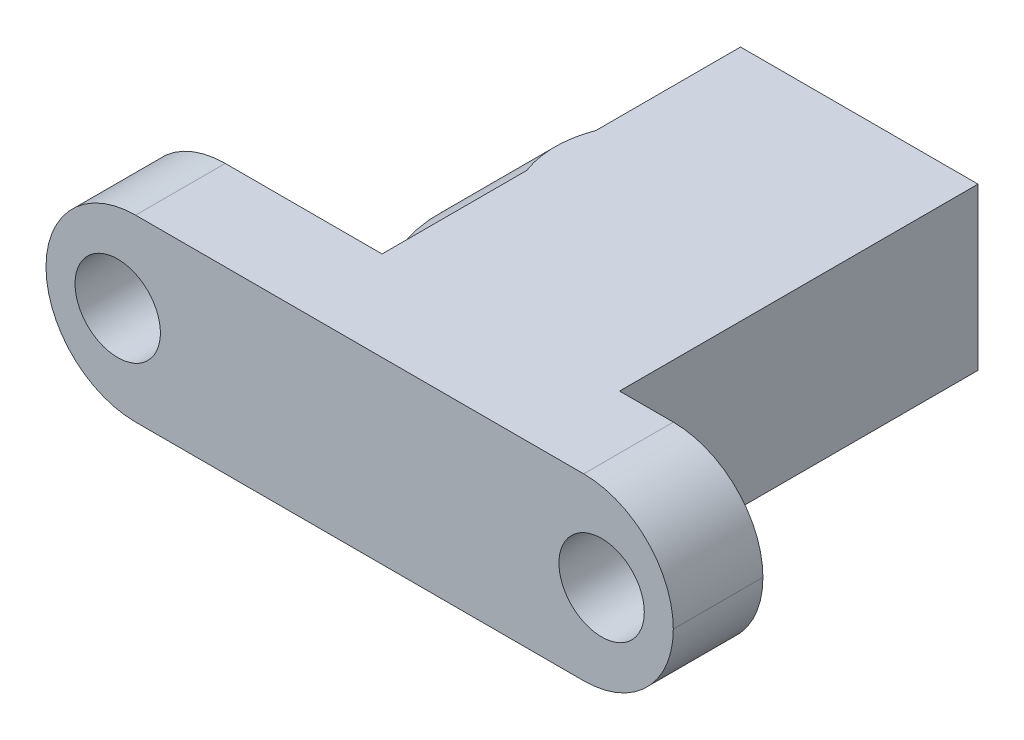
ISO-10303-21;
HEADER;
FILE_DESCRIPTION(('STEP AP214'),'2;1');
FILE_NAME('part.step','',(''),(''),'','','');
FILE_SCHEMA(('AUTOMOTIVE_DESIGN { 1 0 10303 214 1 1 1 1 }'));
ENDSEC;
DATA;
#1=APPLICATION_CONTEXT('core data for automotive mechanical design processes');
#2=APPLICATION_PROTOCOL_DEFINITION('international standard','automotive_design',2000,#1);
#3=PRODUCT_CONTEXT('',#1,'mechanical');
#4=PRODUCT('Part','Part','',(#3));
#5=PRODUCT_RELATED_PRODUCT_CATEGORY('part','',(#4));
#6=PRODUCT_DEFINITION_FORMATION('','',#4);
#7=PRODUCT_DEFINITION_CONTEXT('part definition',#1,'design');
#8=PRODUCT_DEFINITION('design','',#6,#7);
#9=PRODUCT_DEFINITION_SHAPE('','',#8);
#10=(LENGTH_UNIT() NAMED_UNIT(*) SI_UNIT(.MILLI.,.METRE.));
#11=(NAMED_UNIT(*) PLANE_ANGLE_UNIT() SI_UNIT($,.RADIAN.));
#12=(NAMED_UNIT(*) SI_UNIT($,.STERADIAN.) SOLID_ANGLE_UNIT());
#13=UNCERTAINTY_MEASURE_WITH_UNIT(LENGTH_MEASURE(1.E-05),#10,'distance_accuracy_value','');
#14=(GEOMETRIC_REPRESENTATION_CONTEXT(3) GLOBAL_UNCERTAINTY_ASSIGNED_CONTEXT((#13)) GLOBAL_UNIT_ASSIGNED_CONTEXT((#10,
#11,#12)) REPRESENTATION_CONTEXT('',''));
#15=CARTESIAN_POINT('',(0.,0.,0.));
#16=DIRECTION('',(0.,0.,1.));
#17=DIRECTION('',(1.,0.,0.));
#18=AXIS2_PLACEMENT_3D('',#15,#16,#17);
#19=CARTESIAN_POINT('',(9.50000000000001,-4.,-20.));
#20=DIRECTION('',(0.,1.,0.));
#21=DIRECTION('',(0.,0.,1.));
#22=AXIS2_PLACEMENT_3D('',#19,#20,#21);
#23=PLANE('',#22);
#24=DIRECTION('',(-1.,0.,0.));
#25=VECTOR('',#24,1.);
#26=CARTESIAN_POINT('',(9.50000000000001,-4.,-20.));
#27=LINE('',#26,#25);
#28=CARTESIAN_POINT('',(5.98528137423857,-4.,-20.));
#29=VERTEX_POINT('',#28);
#30=CARTESIAN_POINT('',(-2.49999999999999,-4.,-20.));
#31=VERTEX_POINT('',#30);
#32=EDGE_CURVE('E208',#29,#31,#27,.T.);
#33=ORIENTED_EDGE('',*,*,#32,.F.);
#34=DIRECTION('',(0.,0.,-1.));
#35=VECTOR('',#34,1.);
#36=CARTESIAN_POINT('',(5.98528137423857,-4.,1.55322710705489));
#37=LINE('',#36,#35);
#38=CARTESIAN_POINT('',(5.98528137423857,-4.,-14.5));
#39=VERTEX_POINT('',#38);
#40=EDGE_CURVE('E191',#39,#29,#37,.T.);
#41=ORIENTED_EDGE('',*,*,#40,.F.);
#42=CARTESIAN_POINT('',(-2.49999999999999,-4.,-10.));
#43=DIRECTION('',(0.,1.,0.));
#44=DIRECTION('',(1.,0.,0.));
#45=AXIS2_PLACEMENT_3D('',#42,#43,#44);
#46=ELLIPSE('',#45,10.6066017177982,7.5);
#47=CARTESIAN_POINT('',(-2.49999999999999,-4.,-17.5));
#48=VERTEX_POINT('',#47);
#49=EDGE_CURVE('E355',#48,#39,#46,.F.);
#50=ORIENTED_EDGE('',*,*,#49,.F.);
#51=DIRECTION('',(0.,0.,1.));
#52=VECTOR('',#51,1.);
#53=CARTESIAN_POINT('',(-2.49999999999999,-4.,-20.));
#54=LINE('',#53,#52);
#55=EDGE_CURVE('E216',#31,#48,#54,.T.);
#56=ORIENTED_EDGE('',*,*,#55,.F.);
#57=EDGE_LOOP('',(#33,#41,#50,#56));
#58=FACE_BOUND('',#57,.T.);
#59=ADVANCED_FACE('F36',(#58),#23,.F.);
#60=CARTESIAN_POINT('',(5.98528137423857,-4.,-5.49999999999997));
#61=VERTEX_POINT('',#60);
#62=CARTESIAN_POINT('',(-2.49999999999999,-4.,-2.5));
#63=VERTEX_POINT('',#62);
#64=EDGE_CURVE('E350',#61,#63,#46,.F.);
#65=ORIENTED_EDGE('',*,*,#64,.F.);
#66=CARTESIAN_POINT('',(5.98528137423857,-4.,0.));
#67=VERTEX_POINT('',#66);
#68=EDGE_CURVE('E202',#67,#61,#37,.T.);
#69=ORIENTED_EDGE('',*,*,#68,.F.);
#70=DIRECTION('',(-1.,0.,0.));
#71=VECTOR('',#70,1.);
#72=CARTESIAN_POINT('',(9.50000000000001,-4.,0.));
#73=LINE('',#72,#71);
#74=CARTESIAN_POINT('',(-2.49999999999999,-4.,0.));
#75=VERTEX_POINT('',#74);
#76=EDGE_CURVE('E229',#67,#75,#73,.T.);
#77=ORIENTED_EDGE('',*,*,#76,.T.);
#78=EDGE_CURVE('E221',#63,#75,#54,.T.);
#79=ORIENTED_EDGE('',*,*,#78,.F.);
#80=EDGE_LOOP('',(#65,#69,#77,#79));
#81=FACE_BOUND('',#80,.T.);
#82=ADVANCED_FACE('F451',(#81),#23,.F.);
#83=CARTESIAN_POINT('',(0.,0.,0.));
#84=DIRECTION('',(0.,0.,-1.));
#85=DIRECTION('',(-1.,0.,0.));
#86=AXIS2_PLACEMENT_3D('',#83,#84,#85);
#87=PLANE('',#86);
#88=DIRECTION('',(0.,-1.,0.));
#89=VECTOR('',#88,1.);
#90=CARTESIAN_POINT('',(5.98528137423857,-4.,0.));
#91=LINE('',#90,#89);
#92=CARTESIAN_POINT('',(5.98528137423857,-5.,0.));
#93=VERTEX_POINT('',#92);
#94=EDGE_CURVE('E394',#67,#93,#91,.T.);
#95=ORIENTED_EDGE('',*,*,#94,.T.);
#96=DIRECTION('',(1.,0.,0.));
#97=VECTOR('',#96,1.);
#98=CARTESIAN_POINT('',(-17.5,-5.,0.));
#99=LINE('',#98,#97);
#100=CARTESIAN_POINT('',(-12.5,-5.,0.));
#101=VERTEX_POINT('',#100);
#102=EDGE_CURVE('E261',#101,#93,#99,.T.);
#103=ORIENTED_EDGE('',*,*,#102,.F.);
#104=CARTESIAN_POINT('',(-12.5,0.,0.));
#105=DIRECTION('',(0.,0.,-1.));
#106=DIRECTION('',(-1.,0.,0.));
#107=AXIS2_PLACEMENT_3D('',#104,#105,#106);
#108=CIRCLE('',#107,5.);
#109=CARTESIAN_POINT('',(-17.5,0.,0.));
#110=VERTEX_POINT('',#109);
#111=EDGE_CURVE('E281',#101,#110,#108,.T.);
#112=ORIENTED_EDGE('',*,*,#111,.T.);
#113=CARTESIAN_POINT('',(-12.5,0.,0.));
#114=DIRECTION('',(0.,0.,-1.));
#115=DIRECTION('',(-1.,0.,0.));
#116=AXIS2_PLACEMENT_3D('',#113,#114,#115);
#117=CIRCLE('',#116,5.);
#118=CARTESIAN_POINT('',(-12.5,5.,0.));
#119=VERTEX_POINT('',#118);
#120=EDGE_CURVE('E278',#110,#119,#117,.T.);
#121=ORIENTED_EDGE('',*,*,#120,.T.);
#122=DIRECTION('',(-1.,0.,0.));
#123=VECTOR('',#122,1.);
#124=CARTESIAN_POINT('',(-17.5,5.,0.));
#125=LINE('',#124,#123);
#126=CARTESIAN_POINT('',(-3.74999999999999,5.,0.));
#127=VERTEX_POINT('',#126);
#128=EDGE_CURVE('E255',#127,#119,#125,.T.);
#129=ORIENTED_EDGE('',*,*,#128,.F.);
#130=DIRECTION('',(0.,-1.,0.));
#131=VECTOR('',#130,1.);
#132=CARTESIAN_POINT('',(-3.74999999999999,4.48528137423858,0.));
#133=LINE('',#132,#131);
#134=CARTESIAN_POINT('',(-3.74999999999999,4.48528137423858,0.));
#135=VERTEX_POINT('',#134);
#136=EDGE_CURVE('E342',#127,#135,#133,.T.);
#137=ORIENTED_EDGE('',*,*,#136,.T.);
#138=DIRECTION('',(1.,0.,0.));
#139=VECTOR('',#138,1.);
#140=CARTESIAN_POINT('',(-2.49999999999999,4.48528137423858,0.));
#141=LINE('',#140,#139);
#142=CARTESIAN_POINT('',(-2.49999999999999,4.48528137423858,0.));
#143=VERTEX_POINT('',#142);
#144=EDGE_CURVE('E328',#135,#143,#141,.T.);
#145=ORIENTED_EDGE('',*,*,#144,.T.);
#146=DIRECTION('',(0.,1.,0.));
#147=VECTOR('',#146,1.);
#148=CARTESIAN_POINT('',(-2.49999999999999,-4.,0.));
#149=LINE('',#148,#147);
#150=EDGE_CURVE('E234',#75,#143,#149,.T.);
#151=ORIENTED_EDGE('',*,*,#150,.F.);
#152=ORIENTED_EDGE('',*,*,#76,.F.);
#153=EDGE_LOOP('',(#95,#103,#112,#121,#129,#137,#145,#151,#152));
#154=FACE_BOUND('',#153,.T.);
#155=CARTESIAN_POINT('',(-13.5,0.,0.));
#156=DIRECTION('',(0.,0.,1.));
#157=DIRECTION('',(-1.,0.,0.));
#158=AXIS2_PLACEMENT_3D('',#155,#156,#157);
#159=CIRCLE('',#158,2.38125);
#160=CARTESIAN_POINT('',(-15.88125,0.,0.));
#161=VERTEX_POINT('',#160);
#162=EDGE_CURVE('E245',#161,#161,#159,.T.);
#163=ORIENTED_EDGE('',*,*,#162,.T.);
#164=EDGE_LOOP('',(#163));
#165=FACE_BOUND('',#164,.T.);
#166=ADVANCED_FACE('F414',(#154,#165),#87,.T.);
#167=CARTESIAN_POINT('',(-2.49999999999999,-4.,-20.));
#168=DIRECTION('',(1.,0.,0.));
#169=DIRECTION('',(0.,0.,-1.));
#170=AXIS2_PLACEMENT_3D('',#167,#168,#169);
#171=PLANE('',#170);
#172=ORIENTED_EDGE('',*,*,#150,.T.);
#173=DIRECTION('',(0.,0.,-1.));
#174=VECTOR('',#173,1.);
#175=CARTESIAN_POINT('',(-2.49999999999999,4.48528137423858,1.35182663966417));
#176=LINE('',#175,#174);
#177=CARTESIAN_POINT('',(-2.49999999999999,4.48528137423858,-5.50000000000003));
#178=VERTEX_POINT('',#177);
#179=EDGE_CURVE('E335',#143,#178,#176,.T.);
#180=ORIENTED_EDGE('',*,*,#179,.T.);
#181=CARTESIAN_POINT('',(-2.49999999999999,-4.,-10.));
#182=DIRECTION('',(1.,0.,0.));
#183=DIRECTION('',(0.,1.,0.));
#184=AXIS2_PLACEMENT_3D('',#181,#182,#183);
#185=ELLIPSE('',#184,10.6066017177982,7.5);
#186=EDGE_CURVE('E263',#63,#178,#185,.F.);
#187=ORIENTED_EDGE('',*,*,#186,.F.);
#188=ORIENTED_EDGE('',*,*,#78,.T.);
#189=EDGE_LOOP('',(#172,#180,#187,#188));
#190=FACE_BOUND('',#189,.T.);
#191=ADVANCED_FACE('F460',(#190),#171,.F.);
#192=CARTESIAN_POINT('',(9.50000000000001,-4.,0.));
#193=VERTEX_POINT('',#192);
#194=CARTESIAN_POINT('',(7.17377388413928,-4.,0.));
#195=VERTEX_POINT('',#194);
#196=EDGE_CURVE('E231',#193,#195,#73,.T.);
#197=ORIENTED_EDGE('',*,*,#196,.T.);
#198=DIRECTION('',(0.,0.,-1.));
#199=VECTOR('',#198,1.);
#200=CARTESIAN_POINT('',(7.17377388413928,-4.,1.55322710705489));
#201=LINE('',#200,#199);
#202=CARTESIAN_POINT('',(7.17377388413928,-4.,-20.));
#203=VERTEX_POINT('',#202);
#204=EDGE_CURVE('E376',#195,#203,#201,.T.);
#205=ORIENTED_EDGE('',*,*,#204,.T.);
#206=CARTESIAN_POINT('',(9.50000000000001,-4.,-20.));
#207=VERTEX_POINT('',#206);
#208=EDGE_CURVE('E217',#207,#203,#27,.T.);
#209=ORIENTED_EDGE('',*,*,#208,.F.);
#210=DIRECTION('',(0.,0.,1.));
#211=VECTOR('',#210,1.);
#212=CARTESIAN_POINT('',(9.50000000000001,-4.,-20.));
#213=LINE('',#212,#211);
#214=EDGE_CURVE('E239',#207,#193,#213,.T.);
#215=ORIENTED_EDGE('',*,*,#214,.T.);
#216=EDGE_LOOP('',(#197,#205,#209,#215));
#217=FACE_BOUND('',#216,.T.);
#218=ADVANCED_FACE('F375',(#217),#23,.F.);
#219=CARTESIAN_POINT('',(-2.49999999999999,4.48528137423858,-14.5));
#220=VERTEX_POINT('',#219);
#221=EDGE_CURVE('E271',#220,#48,#185,.F.);
#222=ORIENTED_EDGE('',*,*,#221,.F.);
#223=CARTESIAN_POINT('',(-2.49999999999999,4.48528137423858,-20.));
#224=VERTEX_POINT('',#223);
#225=EDGE_CURVE('E339',#220,#224,#176,.T.);
#226=ORIENTED_EDGE('',*,*,#225,.T.);
#227=DIRECTION('',(0.,1.,0.));
#228=VECTOR('',#227,1.);
#229=CARTESIAN_POINT('',(-2.49999999999999,4.,-20.));
#230=LINE('',#229,#228);
#231=EDGE_CURVE('E237',#31,#224,#230,.T.);
#232=ORIENTED_EDGE('',*,*,#231,.F.);
#233=ORIENTED_EDGE('',*,*,#55,.T.);
#234=EDGE_LOOP('',(#222,#226,#232,#233));
#235=FACE_BOUND('',#234,.T.);
#236=ADVANCED_FACE('F404',(#235),#171,.F.);
#237=CARTESIAN_POINT('',(0.,0.,5.));
#238=DIRECTION('',(0.,0.,-1.));
#239=DIRECTION('',(-1.,0.,0.));
#240=AXIS2_PLACEMENT_3D('',#237,#238,#239);
#241=PLANE('',#240);
#242=CARTESIAN_POINT('',(12.5,0.,5.));
#243=DIRECTION('',(0.,0.,-1.));
#244=DIRECTION('',(-1.,0.,0.));
#245=AXIS2_PLACEMENT_3D('',#242,#243,#244);
#246=CIRCLE('',#245,5.);
#247=CARTESIAN_POINT('',(12.5,-5.,5.));
#248=VERTEX_POINT('',#247);
#249=CARTESIAN_POINT('',(17.5,0.,5.));
#250=VERTEX_POINT('',#249);
#251=EDGE_CURVE('E292',#248,#250,#246,.F.);
#252=ORIENTED_EDGE('',*,*,#251,.T.);
#253=CARTESIAN_POINT('',(12.5,0.,5.));
#254=DIRECTION('',(0.,0.,-1.));
#255=DIRECTION('',(-1.,0.,0.));
#256=AXIS2_PLACEMENT_3D('',#253,#254,#255);
#257=CIRCLE('',#256,5.);
#258=CARTESIAN_POINT('',(12.5,5.,5.));
#259=VERTEX_POINT('',#258);
#260=EDGE_CURVE('E294',#250,#259,#257,.F.);
#261=ORIENTED_EDGE('',*,*,#260,.T.);
#262=DIRECTION('',(-1.,0.,0.));
#263=VECTOR('',#262,1.);
#264=CARTESIAN_POINT('',(-17.5,5.,5.));
#265=LINE('',#264,#263);
#266=CARTESIAN_POINT('',(-12.5,5.,5.));
#267=VERTEX_POINT('',#266);
#268=EDGE_CURVE('E258',#259,#267,#265,.T.);
#269=ORIENTED_EDGE('',*,*,#268,.T.);
#270=CARTESIAN_POINT('',(-12.5,0.,5.));
#271=DIRECTION('',(0.,0.,-1.));
#272=DIRECTION('',(-1.,0.,0.));
#273=AXIS2_PLACEMENT_3D('',#270,#271,#272);
#274=CIRCLE('',#273,5.);
#275=CARTESIAN_POINT('',(-17.5,0.,5.));
#276=VERTEX_POINT('',#275);
#277=EDGE_CURVE('E288',#267,#276,#274,.F.);
#278=ORIENTED_EDGE('',*,*,#277,.T.);
#279=CARTESIAN_POINT('',(-12.5,0.,5.));
#280=DIRECTION('',(0.,0.,-1.));
#281=DIRECTION('',(-1.,0.,0.));
#282=AXIS2_PLACEMENT_3D('',#279,#280,#281);
#283=CIRCLE('',#282,5.);
#284=CARTESIAN_POINT('',(-12.5,-5.,5.));
#285=VERTEX_POINT('',#284);
#286=EDGE_CURVE('E290',#276,#285,#283,.F.);
#287=ORIENTED_EDGE('',*,*,#286,.T.);
#288=DIRECTION('',(1.,0.,0.));
#289=VECTOR('',#288,1.);
#290=CARTESIAN_POINT('',(-17.5,-5.,5.));
#291=LINE('',#290,#289);
#292=EDGE_CURVE('E260',#285,#248,#291,.T.);
#293=ORIENTED_EDGE('',*,*,#292,.T.);
#294=EDGE_LOOP('',(#252,#261,#269,#278,#287,#293));
#295=FACE_BOUND('',#294,.T.);
#296=CARTESIAN_POINT('',(13.5,0.,5.));
#297=DIRECTION('',(0.,0.,1.));
#298=DIRECTION('',(1.,0.,0.));
#299=AXIS2_PLACEMENT_3D('',#296,#297,#298);
#300=CIRCLE('',#299,2.38125000000001);
#301=CARTESIAN_POINT('',(15.88125,0.,5.));
#302=VERTEX_POINT('',#301);
#303=EDGE_CURVE('E252',#302,#302,#300,.T.);
#304=ORIENTED_EDGE('',*,*,#303,.F.);
#305=EDGE_LOOP('',(#304));
#306=FACE_BOUND('',#305,.T.);
#307=CARTESIAN_POINT('',(-13.5,0.,5.));
#308=DIRECTION('',(0.,0.,1.));
#309=DIRECTION('',(-1.,0.,0.));
#310=AXIS2_PLACEMENT_3D('',#307,#308,#309);
#311=CIRCLE('',#310,2.38125);
#312=CARTESIAN_POINT('',(-15.88125,0.,5.));
#313=VERTEX_POINT('',#312);
#314=EDGE_CURVE('E246',#313,#313,#311,.T.);
#315=ORIENTED_EDGE('',*,*,#314,.F.);
#316=EDGE_LOOP('',(#315));
#317=FACE_BOUND('',#316,.T.);
#318=ADVANCED_FACE('F437',(#295,#306,#317),#241,.F.);
#319=DIRECTION('',(0.,1.,0.));
#320=VECTOR('',#319,1.);
#321=CARTESIAN_POINT('',(7.17377388413928,-4.,0.));
#322=LINE('',#321,#320);
#323=CARTESIAN_POINT('',(7.17377388413928,-5.,0.));
#324=VERTEX_POINT('',#323);
#325=EDGE_CURVE('E388',#324,#195,#322,.T.);
#326=ORIENTED_EDGE('',*,*,#325,.T.);
#327=ORIENTED_EDGE('',*,*,#196,.F.);
#328=DIRECTION('',(0.,-1.,0.));
#329=VECTOR('',#328,1.);
#330=CARTESIAN_POINT('',(9.50000000000001,-4.,0.));
#331=LINE('',#330,#329);
#332=CARTESIAN_POINT('',(9.50000000000002,5.,0.));
#333=VERTEX_POINT('',#332);
#334=EDGE_CURVE('E226',#333,#193,#331,.T.);
#335=ORIENTED_EDGE('',*,*,#334,.F.);
#336=CARTESIAN_POINT('',(12.5,5.,0.));
#337=VERTEX_POINT('',#336);
#338=EDGE_CURVE('E264',#337,#333,#125,.T.);
#339=ORIENTED_EDGE('',*,*,#338,.F.);
#340=CARTESIAN_POINT('',(12.5,0.,0.));
#341=DIRECTION('',(0.,0.,-1.));
#342=DIRECTION('',(-1.,0.,0.));
#343=AXIS2_PLACEMENT_3D('',#340,#341,#342);
#344=CIRCLE('',#343,5.);
#345=CARTESIAN_POINT('',(17.5,0.,0.));
#346=VERTEX_POINT('',#345);
#347=EDGE_CURVE('E286',#337,#346,#344,.T.);
#348=ORIENTED_EDGE('',*,*,#347,.T.);
#349=CARTESIAN_POINT('',(12.5,0.,0.));
#350=DIRECTION('',(0.,0.,-1.));
#351=DIRECTION('',(-1.,0.,0.));
#352=AXIS2_PLACEMENT_3D('',#349,#350,#351);
#353=CIRCLE('',#352,5.);
#354=CARTESIAN_POINT('',(12.5,-5.,0.));
#355=VERTEX_POINT('',#354);
#356=EDGE_CURVE('E283',#346,#355,#353,.T.);
#357=ORIENTED_EDGE('',*,*,#356,.T.);
#358=EDGE_CURVE('E266',#324,#355,#99,.T.);
#359=ORIENTED_EDGE('',*,*,#358,.F.);
#360=EDGE_LOOP('',(#326,#327,#335,#339,#348,#357,#359));
#361=FACE_BOUND('',#360,.T.);
#362=CARTESIAN_POINT('',(13.5,0.,0.));
#363=DIRECTION('',(0.,0.,1.));
#364=DIRECTION('',(1.,0.,0.));
#365=AXIS2_PLACEMENT_3D('',#362,#363,#364);
#366=CIRCLE('',#365,2.38125000000001);
#367=CARTESIAN_POINT('',(15.88125,0.,0.));
#368=VERTEX_POINT('',#367);
#369=EDGE_CURVE('E249',#368,#368,#366,.T.);
#370=ORIENTED_EDGE('',*,*,#369,.T.);
#371=EDGE_LOOP('',(#370));
#372=FACE_BOUND('',#371,.T.);
#373=ADVANCED_FACE('F432',(#361,#372),#87,.T.);
#374=CARTESIAN_POINT('',(-17.5,5.,5.));
#375=DIRECTION('',(0.,-1.,0.));
#376=DIRECTION('',(0.,0.,-1.));
#377=AXIS2_PLACEMENT_3D('',#374,#375,#376);
#378=PLANE('',#377);
#379=DIRECTION('',(0.,0.,-1.));
#380=VECTOR('',#379,1.);
#381=CARTESIAN_POINT('',(-12.5,5.,5.));
#382=LINE('',#381,#380);
#383=EDGE_CURVE('E272',#119,#267,#382,.F.);
#384=ORIENTED_EDGE('',*,*,#383,.T.);
#385=ORIENTED_EDGE('',*,*,#268,.F.);
#386=DIRECTION('',(0.,0.,-1.));
#387=VECTOR('',#386,1.);
#388=CARTESIAN_POINT('',(12.5,5.,5.));
#389=LINE('',#388,#387);
#390=EDGE_CURVE('E275',#259,#337,#389,.T.);
#391=ORIENTED_EDGE('',*,*,#390,.T.);
#392=ORIENTED_EDGE('',*,*,#338,.T.);
#393=DIRECTION('',(0.,0.,1.));
#394=VECTOR('',#393,1.);
#395=CARTESIAN_POINT('',(9.50000000000001,5.,-20.));
#396=LINE('',#395,#394);
#397=CARTESIAN_POINT('',(9.50000000000001,5.,-20.));
#398=VERTEX_POINT('',#397);
#399=EDGE_CURVE('E242',#398,#333,#396,.T.);
#400=ORIENTED_EDGE('',*,*,#399,.F.);
#401=DIRECTION('',(1.,0.,0.));
#402=VECTOR('',#401,1.);
#403=CARTESIAN_POINT('',(9.50000000000001,5.,-20.));
#404=LINE('',#403,#402);
#405=CARTESIAN_POINT('',(-3.74999999999999,5.,-20.));
#406=VERTEX_POINT('',#405);
#407=EDGE_CURVE('E222',#406,#398,#404,.T.);
#408=ORIENTED_EDGE('',*,*,#407,.F.);
#409=DIRECTION('',(0.,0.,-1.));
#410=VECTOR('',#409,1.);
#411=CARTESIAN_POINT('',(-3.74999999999999,5.,1.35182663966417));
#412=LINE('',#411,#410);
#413=CARTESIAN_POINT('',(-3.74999999999999,5.,-11.9284060775677));
#414=VERTEX_POINT('',#413);
#415=EDGE_CURVE('E330',#414,#406,#412,.T.);
#416=ORIENTED_EDGE('',*,*,#415,.F.);
#417=CARTESIAN_POINT('',(6.50000000000004,5.,-10.));
#418=DIRECTION('',(0.,-1.,0.));
#419=DIRECTION('',(1.,0.,0.));
#420=AXIS2_PLACEMENT_3D('',#417,#418,#419);
#421=ELLIPSE('',#420,10.6066017177982,7.5);
#422=CARTESIAN_POINT('',(-3.74999999999999,5.,-8.07159392243235));
#423=VERTEX_POINT('',#422);
#424=EDGE_CURVE('E315',#423,#414,#421,.T.);
#425=ORIENTED_EDGE('',*,*,#424,.F.);
#426=EDGE_CURVE('E323',#127,#423,#412,.T.);
#427=ORIENTED_EDGE('',*,*,#426,.F.);
#428=ORIENTED_EDGE('',*,*,#128,.T.);
#429=EDGE_LOOP('',(#384,#385,#391,#392,#400,#408,#416,#425,#427,#428));
#430=FACE_BOUND('',#429,.T.);
#431=ADVANCED_FACE('F367',(#430),#378,.F.);
#432=CARTESIAN_POINT('',(-17.5,-5.,5.));
#433=DIRECTION('',(0.,1.,0.));
#434=DIRECTION('',(0.,0.,1.));
#435=AXIS2_PLACEMENT_3D('',#432,#433,#434);
#436=PLANE('',#435);
#437=ORIENTED_EDGE('',*,*,#102,.T.);
#438=DIRECTION('',(0.,0.,-1.));
#439=VECTOR('',#438,1.);
#440=CARTESIAN_POINT('',(5.98528137423857,-5.,1.55322710705489));
#441=LINE('',#440,#439);
#442=CARTESIAN_POINT('',(5.98528137423857,-5.,-6.64370462775373));
#443=VERTEX_POINT('',#442);
#444=EDGE_CURVE('E386',#93,#443,#441,.T.);
#445=ORIENTED_EDGE('',*,*,#444,.T.);
#446=CARTESIAN_POINT('',(-3.49999999999999,-5.,-10.));
#447=DIRECTION('',(0.,-1.,0.));
#448=DIRECTION('',(1.,0.,0.));
#449=AXIS2_PLACEMENT_3D('',#446,#447,#448);
#450=ELLIPSE('',#449,10.6066017177982,7.5);
#451=CARTESIAN_POINT('',(6.98528137423856,-5.,-8.86887787948285));
#452=VERTEX_POINT('',#451);
#453=EDGE_CURVE('E51',#452,#443,#450,.T.);
#454=ORIENTED_EDGE('',*,*,#453,.F.);
#455=DIRECTION('',(0.,0.,1.));
#456=VECTOR('',#455,1.);
#457=CARTESIAN_POINT('',(6.98528137423856,-5.,-10.));
#458=LINE('',#457,#456);
#459=CARTESIAN_POINT('',(6.98528137423856,-5.,-11.1311221205172));
#460=VERTEX_POINT('',#459);
#461=EDGE_CURVE('E11',#460,#452,#458,.T.);
#462=ORIENTED_EDGE('',*,*,#461,.F.);
#463=CARTESIAN_POINT('',(5.98528137423857,-5.,-13.3562953722463));
#464=VERTEX_POINT('',#463);
#465=EDGE_CURVE('E391',#464,#460,#450,.T.);
#466=ORIENTED_EDGE('',*,*,#465,.F.);
#467=CARTESIAN_POINT('',(5.98528137423857,-5.,-20.));
#468=VERTEX_POINT('',#467);
#469=EDGE_CURVE('E383',#464,#468,#441,.T.);
#470=ORIENTED_EDGE('',*,*,#469,.T.);
#471=DIRECTION('',(-1.,0.,0.));
#472=VECTOR('',#471,1.);
#473=CARTESIAN_POINT('',(5.98528137423857,-5.,-20.));
#474=LINE('',#473,#472);
#475=CARTESIAN_POINT('',(7.17377388413928,-5.,-20.));
#476=VERTEX_POINT('',#475);
#477=EDGE_CURVE('E203',#476,#468,#474,.T.);
#478=ORIENTED_EDGE('',*,*,#477,.F.);
#479=DIRECTION('',(0.,0.,-1.));
#480=VECTOR('',#479,1.);
#481=CARTESIAN_POINT('',(7.17377388413928,-5.,1.55322710705489));
#482=LINE('',#481,#480);
#483=EDGE_CURVE('E381',#324,#476,#482,.T.);
#484=ORIENTED_EDGE('',*,*,#483,.F.);
#485=ORIENTED_EDGE('',*,*,#358,.T.);
#486=DIRECTION('',(0.,0.,-1.));
#487=VECTOR('',#486,1.);
#488=CARTESIAN_POINT('',(12.5,-5.,5.));
#489=LINE('',#488,#487);
#490=EDGE_CURVE('E57',#355,#248,#489,.F.);
#491=ORIENTED_EDGE('',*,*,#490,.T.);
#492=ORIENTED_EDGE('',*,*,#292,.F.);
#493=DIRECTION('',(0.,0.,-1.));
#494=VECTOR('',#493,1.);
#495=CARTESIAN_POINT('',(-12.5,-5.,5.));
#496=LINE('',#495,#494);
#497=EDGE_CURVE('E296',#285,#101,#496,.T.);
#498=ORIENTED_EDGE('',*,*,#497,.T.);
#499=EDGE_LOOP('',(#437,#445,#454,#462,#466,#470,#478,#484,#485,#491,#492,#498));
#500=FACE_BOUND('',#499,.T.);
#501=ADVANCED_FACE('F380',(#500),#436,.F.);
#502=CARTESIAN_POINT('',(13.5,0.,5.));
#503=DIRECTION('',(0.,0.,-1.));
#504=DIRECTION('',(-1.,0.,0.));
#505=AXIS2_PLACEMENT_3D('',#502,#503,#504);
#506=CYLINDRICAL_SURFACE('',#505,2.38125000000001);
#507=ORIENTED_EDGE('',*,*,#303,.T.);
#508=EDGE_LOOP('',(#507));
#509=FACE_BOUND('',#508,.T.);
#510=ORIENTED_EDGE('',*,*,#369,.F.);
#511=EDGE_LOOP('',(#510));
#512=FACE_BOUND('',#511,.T.);
#513=ADVANCED_FACE('F578',(#509,#512),#506,.F.);
#514=CARTESIAN_POINT('',(-13.5,0.,5.));
#515=DIRECTION('',(0.,0.,-1.));
#516=DIRECTION('',(-1.,0.,0.));
#517=AXIS2_PLACEMENT_3D('',#514,#515,#516);
#518=CYLINDRICAL_SURFACE('',#517,2.38125);
#519=ORIENTED_EDGE('',*,*,#314,.T.);
#520=EDGE_LOOP('',(#519));
#521=FACE_BOUND('',#520,.T.);
#522=ORIENTED_EDGE('',*,*,#162,.F.);
#523=EDGE_LOOP('',(#522));
#524=FACE_BOUND('',#523,.T.);
#525=ADVANCED_FACE('F667',(#521,#524),#518,.F.);
#526=CARTESIAN_POINT('',(9.50000000000001,-4.,-20.));
#527=DIRECTION('',(-1.,0.,0.));
#528=DIRECTION('',(0.,-1.,0.));
#529=AXIS2_PLACEMENT_3D('',#526,#527,#528);
#530=PLANE('',#529);
#531=ORIENTED_EDGE('',*,*,#334,.T.);
#532=ORIENTED_EDGE('',*,*,#214,.F.);
#533=DIRECTION('',(0.,-1.,0.));
#534=VECTOR('',#533,1.);
#535=CARTESIAN_POINT('',(9.50000000000002,4.,-20.));
#536=LINE('',#535,#534);
#537=EDGE_CURVE('E218',#398,#207,#536,.T.);
#538=ORIENTED_EDGE('',*,*,#537,.F.);
#539=ORIENTED_EDGE('',*,*,#399,.T.);
#540=EDGE_LOOP('',(#531,#532,#538,#539));
#541=FACE_BOUND('',#540,.T.);
#542=ADVANCED_FACE('F371',(#541),#530,.F.);
#543=CARTESIAN_POINT('',(0.,0.,-20.));
#544=DIRECTION('',(0.,0.,1.));
#545=DIRECTION('',(1.,0.,0.));
#546=AXIS2_PLACEMENT_3D('',#543,#544,#545);
#547=PLANE('',#546);
#548=ORIENTED_EDGE('',*,*,#231,.T.);
#549=DIRECTION('',(-1.,0.,0.));
#550=VECTOR('',#549,1.);
#551=CARTESIAN_POINT('',(-2.49999999999999,4.48528137423858,-20.));
#552=LINE('',#551,#550);
#553=CARTESIAN_POINT('',(-3.74999999999999,4.48528137423858,-20.));
#554=VERTEX_POINT('',#553);
#555=EDGE_CURVE('E399',#224,#554,#552,.T.);
#556=ORIENTED_EDGE('',*,*,#555,.T.);
#557=DIRECTION('',(0.,1.,0.));
#558=VECTOR('',#557,1.);
#559=CARTESIAN_POINT('',(-3.74999999999999,4.48528137423858,-20.));
#560=LINE('',#559,#558);
#561=EDGE_CURVE('E364',#554,#406,#560,.T.);
#562=ORIENTED_EDGE('',*,*,#561,.T.);
#563=ORIENTED_EDGE('',*,*,#407,.T.);
#564=ORIENTED_EDGE('',*,*,#537,.T.);
#565=ORIENTED_EDGE('',*,*,#208,.T.);
#566=DIRECTION('',(0.,-1.,0.));
#567=VECTOR('',#566,1.);
#568=CARTESIAN_POINT('',(7.17377388413928,-4.,-20.));
#569=LINE('',#568,#567);
#570=EDGE_CURVE('E212',#203,#476,#569,.T.);
#571=ORIENTED_EDGE('',*,*,#570,.T.);
#572=ORIENTED_EDGE('',*,*,#477,.T.);
#573=DIRECTION('',(0.,1.,0.));
#574=VECTOR('',#573,1.);
#575=CARTESIAN_POINT('',(5.98528137423857,-4.,-20.));
#576=LINE('',#575,#574);
#577=EDGE_CURVE('E195',#468,#29,#576,.T.);
#578=ORIENTED_EDGE('',*,*,#577,.T.);
#579=ORIENTED_EDGE('',*,*,#32,.T.);
#580=EDGE_LOOP('',(#548,#556,#562,#563,#564,#565,#571,#572,#578,#579));
#581=FACE_BOUND('',#580,.T.);
#582=ADVANCED_FACE('F207',(#581),#547,.F.);
#583=CARTESIAN_POINT('',(-5.32842712474618,-6.82842712474619,-10.));
#584=DIRECTION('',(0.707106781186549,0.707106781186546,0.));
#585=DIRECTION('',(-0.707106781186546,0.707106781186549,0.));
#586=AXIS2_PLACEMENT_3D('',#583,#584,#585);
#587=CYLINDRICAL_SURFACE('',#586,7.5);
#588=CARTESIAN_POINT('',(-5.32842712474618,-6.82842712474619,-10.));
#589=DIRECTION('',(-0.707106781186549,-0.707106781186546,0.));
#590=DIRECTION('',(0.707106781186546,-0.707106781186549,0.));
#591=AXIS2_PLACEMENT_3D('',#588,#589,#590);
#592=CIRCLE('',#591,7.5);
#593=CARTESIAN_POINT('',(-0.0251262658470868,-12.1317279836453,-10.));
#594=VERTEX_POINT('',#593);
#595=EDGE_CURVE('E347',#594,#594,#592,.T.);
#596=ORIENTED_EDGE('',*,*,#595,.F.);
#597=EDGE_LOOP('',(#596));
#598=FACE_BOUND('',#597,.T.);
#599=ORIENTED_EDGE('',*,*,#453,.T.);
#600=CARTESIAN_POINT('',(5.98528137423857,4.48528137423852,-10.));
#601=DIRECTION('',(-1.,0.,0.));
#602=DIRECTION('',(0.,1.,0.));
#603=AXIS2_PLACEMENT_3D('',#600,#601,#602);
#604=ELLIPSE('',#603,10.6066017177982,7.5);
#605=EDGE_CURVE('E395',#443,#61,#604,.T.);
#606=ORIENTED_EDGE('',*,*,#605,.T.);
#607=ORIENTED_EDGE('',*,*,#64,.T.);
#608=ORIENTED_EDGE('',*,*,#186,.T.);
#609=CARTESIAN_POINT('',(5.98528137423863,4.48528137423858,-10.));
#610=DIRECTION('',(0.,-1.,0.));
#611=DIRECTION('',(1.,0.,0.));
#612=AXIS2_PLACEMENT_3D('',#609,#610,#611);
#613=ELLIPSE('',#612,10.6066017177982,7.5);
#614=CARTESIAN_POINT('',(-3.74999999999999,4.48528137423858,-7.02306394388433));
#615=VERTEX_POINT('',#614);
#616=EDGE_CURVE('E307',#178,#615,#613,.T.);
#617=ORIENTED_EDGE('',*,*,#616,.T.);
#618=CARTESIAN_POINT('',(-3.74999999999999,-5.24999999999999,-10.));
#619=DIRECTION('',(-1.,0.,0.));
#620=DIRECTION('',(0.,1.,0.));
#621=AXIS2_PLACEMENT_3D('',#618,#619,#620);
#622=ELLIPSE('',#621,10.6066017177982,7.5);
#623=EDGE_CURVE('E44',#615,#423,#622,.T.);
#624=ORIENTED_EDGE('',*,*,#623,.T.);
#625=ORIENTED_EDGE('',*,*,#424,.T.);
#626=CARTESIAN_POINT('',(-3.74999999999999,4.48528137423858,-12.9769360561157));
#627=VERTEX_POINT('',#626);
#628=EDGE_CURVE('E300',#414,#627,#622,.T.);
#629=ORIENTED_EDGE('',*,*,#628,.T.);
#630=EDGE_CURVE('E341',#627,#220,#613,.T.);
#631=ORIENTED_EDGE('',*,*,#630,.T.);
#632=ORIENTED_EDGE('',*,*,#221,.T.);
#633=ORIENTED_EDGE('',*,*,#49,.T.);
#634=EDGE_CURVE('E198',#39,#464,#604,.T.);
#635=ORIENTED_EDGE('',*,*,#634,.T.);
#636=ORIENTED_EDGE('',*,*,#465,.T.);
#637=CARTESIAN_POINT('',(1.74264068711931,0.242640687119277,-10.));
#638=DIRECTION('',(-0.707106781186549,-0.707106781186546,0.));
#639=DIRECTION('',(0.707106781186546,-0.707106781186549,0.));
#640=AXIS2_PLACEMENT_3D('',#637,#638,#639);
#641=CIRCLE('',#640,7.5);
#642=EDGE_CURVE('E346',#460,#452,#641,.T.);
#643=ORIENTED_EDGE('',*,*,#642,.T.);
#644=EDGE_LOOP('',(#599,#606,#607,#608,#617,#624,#625,#629,#631,#632,#633,#635,#636,#643));
#645=FACE_BOUND('',#644,.T.);
#646=ADVANCED_FACE('F314',(#598,#645),#587,.T.);
#647=CARTESIAN_POINT('',(1.74264068711931,0.242640687119277,-10.));
#648=DIRECTION('',(-0.707106781186549,-0.707106781186546,0.));
#649=DIRECTION('',(0.707106781186546,-0.707106781186549,0.));
#650=AXIS2_PLACEMENT_3D('',#647,#648,#649);
#651=PLANE('',#650);
#652=ORIENTED_EDGE('',*,*,#642,.F.);
#653=ORIENTED_EDGE('',*,*,#461,.T.);
#654=EDGE_LOOP('',(#652,#653));
#655=FACE_BOUND('',#654,.T.);
#656=ADVANCED_FACE('F484',(#655),#651,.F.);
#657=CARTESIAN_POINT('',(-5.32842712474618,-6.82842712474619,-10.));
#658=DIRECTION('',(-0.707106781186549,-0.707106781186546,0.));
#659=DIRECTION('',(0.707106781186546,-0.707106781186549,0.));
#660=AXIS2_PLACEMENT_3D('',#657,#658,#659);
#661=PLANE('',#660);
#662=ORIENTED_EDGE('',*,*,#595,.T.);
#663=EDGE_LOOP('',(#662));
#664=FACE_BOUND('',#663,.T.);
#665=CARTESIAN_POINT('',(-5.32842712474618,-6.82842712474619,-10.));
#666=DIRECTION('',(-0.707106781186549,-0.707106781186546,0.));
#667=DIRECTION('',(0.707106781186546,-0.707106781186549,0.));
#668=AXIS2_PLACEMENT_3D('',#665,#666,#667);
#669=CIRCLE('',#668,5.5);
#670=CARTESIAN_POINT('',(-1.43933982822018,-10.7175144212722,-10.));
#671=VERTEX_POINT('',#670);
#672=EDGE_CURVE('E304',#671,#671,#669,.T.);
#673=ORIENTED_EDGE('',*,*,#672,.F.);
#674=EDGE_LOOP('',(#673));
#675=FACE_BOUND('',#674,.T.);
#676=ADVANCED_FACE('F480',(#664,#675),#661,.T.);
#677=CARTESIAN_POINT('',(1.74264068711931,0.242640687119277,-10.));
#678=DIRECTION('',(-0.707106781186549,-0.707106781186546,0.));
#679=DIRECTION('',(0.707106781186546,-0.707106781186549,0.));
#680=AXIS2_PLACEMENT_3D('',#677,#678,#679);
#681=PLANE('',#680);
#682=CARTESIAN_POINT('',(1.74264068711931,0.242640687119277,-10.));
#683=DIRECTION('',(-0.707106781186549,-0.707106781186546,0.));
#684=DIRECTION('',(0.707106781186546,-0.707106781186549,0.));
#685=AXIS2_PLACEMENT_3D('',#682,#683,#684);
#686=CIRCLE('',#685,5.5);
#687=CARTESIAN_POINT('',(5.63172798364531,-3.64644660940674,-10.));
#688=VERTEX_POINT('',#687);
#689=EDGE_CURVE('E230',#688,#688,#686,.T.);
#690=ORIENTED_EDGE('',*,*,#689,.T.);
#691=EDGE_LOOP('',(#690));
#692=FACE_BOUND('',#691,.T.);
#693=ADVANCED_FACE('F476',(#692),#681,.T.);
#694=CARTESIAN_POINT('',(1.74264068711931,0.242640687119277,-10.));
#695=DIRECTION('',(-0.707106781186549,-0.707106781186546,0.));
#696=DIRECTION('',(0.707106781186546,-0.707106781186549,0.));
#697=AXIS2_PLACEMENT_3D('',#694,#695,#696);
#698=CYLINDRICAL_SURFACE('',#697,5.5);
#699=CARTESIAN_POINT('',(5.63172798364531,-3.64644660940674,-10.));
#700=CARTESIAN_POINT('',(5.55807102727171,-3.72010356578034,-10.));
#701=CARTESIAN_POINT('',(5.48441407089811,-3.79376052215394,-10.));
#702=CARTESIAN_POINT('',(5.33710015815092,-3.94107443490114,-10.));
#703=CARTESIAN_POINT('',(5.26344320177732,-4.01473139127473,-10.));
#704=CARTESIAN_POINT('',(5.11612928903012,-4.16204530402193,-10.));
#705=CARTESIAN_POINT('',(5.04247233265652,-4.23570226039553,-10.));
#706=CARTESIAN_POINT('',(4.89515841990932,-4.38301617314273,-10.));
#707=CARTESIAN_POINT('',(4.82150146353572,-4.45667312951633,-10.));
#708=CARTESIAN_POINT('',(4.67418755078853,-4.60398704226352,-10.));
#709=CARTESIAN_POINT('',(4.60053059441493,-4.67764399863712,-10.));
#710=CARTESIAN_POINT('',(4.45321668166773,-4.82495791138432,-10.));
#711=CARTESIAN_POINT('',(4.37955972529413,-4.89861486775792,-10.));
#712=CARTESIAN_POINT('',(4.23224581254693,-5.04592878050511,-10.));
#713=CARTESIAN_POINT('',(4.15858885617333,-5.11958573687871,-10.));
#714=CARTESIAN_POINT('',(4.01127494342614,-5.26689964962591,-10.));
#715=CARTESIAN_POINT('',(3.93761798705254,-5.34055660599951,-10.));
#716=CARTESIAN_POINT('',(3.79030407430534,-5.48787051874671,-10.));
#717=CARTESIAN_POINT('',(3.71664711793174,-5.5615274751203,-10.));
#718=CARTESIAN_POINT('',(3.56933320518454,-5.7088413878675,-10.));
#719=CARTESIAN_POINT('',(3.49567624881094,-5.7824983442411,-10.));
#720=CARTESIAN_POINT('',(3.34836233606375,-5.9298122569883,-10.));
#721=CARTESIAN_POINT('',(3.27470537969015,-6.0034692133619,-10.));
#722=CARTESIAN_POINT('',(3.12739146694295,-6.15078312610909,-10.));
#723=CARTESIAN_POINT('',(3.05373451056935,-6.22444008248269,-10.));
#724=CARTESIAN_POINT('',(2.90642059782215,-6.37175399522989,-10.));
#725=CARTESIAN_POINT('',(2.83276364144856,-6.44541095160349,-10.));
#726=CARTESIAN_POINT('',(2.68544972870136,-6.59272486435068,-10.));
#727=CARTESIAN_POINT('',(2.61179277232776,-6.66638182072428,-10.));
#728=CARTESIAN_POINT('',(2.46447885958056,-6.81369573347148,-10.));
#729=CARTESIAN_POINT('',(2.39082190320696,-6.88735268984508,-10.));
#730=CARTESIAN_POINT('',(2.24350799045976,-7.03466660259228,-10.));
#731=CARTESIAN_POINT('',(2.16985103408617,-7.10832355896587,-10.));
#732=CARTESIAN_POINT('',(2.02253712133897,-7.25563747171307,-10.));
#733=CARTESIAN_POINT('',(1.94888016496537,-7.32929442808667,-10.));
#734=CARTESIAN_POINT('',(1.80156625221817,-7.47660834083387,-10.));
#735=CARTESIAN_POINT('',(1.72790929584457,-7.55026529720747,-10.));
#736=CARTESIAN_POINT('',(1.58059538309738,-7.69757920995466,-10.));
#737=CARTESIAN_POINT('',(1.50693842672378,-7.77123616632826,-10.));
#738=CARTESIAN_POINT('',(1.35962451397658,-7.91855007907546,-10.));
#739=CARTESIAN_POINT('',(1.28596755760298,-7.99220703544906,-10.));
#740=CARTESIAN_POINT('',(1.13865364485578,-8.13952094819625,-10.));
#741=CARTESIAN_POINT('',(1.06499668848218,-8.21317790456985,-10.));
#742=CARTESIAN_POINT('',(0.917682775734986,-8.36049181731705,-10.));
#743=CARTESIAN_POINT('',(0.844025819361387,-8.43414877369065,-10.));
#744=CARTESIAN_POINT('',(0.69671190661419,-8.58146268643785,-10.));
#745=CARTESIAN_POINT('',(0.623054950240591,-8.65511964281144,-10.));
#746=CARTESIAN_POINT('',(0.475741037493393,-8.80243355555864,-10.));
#747=CARTESIAN_POINT('',(0.402084081119794,-8.87609051193224,-10.));
#748=CARTESIAN_POINT('',(0.254770168372597,-9.02340442467944,-10.));
#749=CARTESIAN_POINT('',(0.181113211998998,-9.09706138105304,-10.));
#750=CARTESIAN_POINT('',(0.0337992992518,-9.24437529380023,-10.));
#751=CARTESIAN_POINT('',(-0.0398576571217993,-9.31803225017383,-10.));
#752=CARTESIAN_POINT('',(-0.187171569868997,-9.46534616292103,-10.));
#753=CARTESIAN_POINT('',(-0.260828526242595,-9.53900311929463,-10.));
#754=CARTESIAN_POINT('',(-0.408142438989793,-9.68631703204183,-10.));
#755=CARTESIAN_POINT('',(-0.481799395363392,-9.75997398841542,-10.));
#756=CARTESIAN_POINT('',(-0.62911330811059,-9.90728790116262,-10.));
#757=CARTESIAN_POINT('',(-0.702770264484188,-9.98094485753622,-10.));
#758=CARTESIAN_POINT('',(-0.850084177231385,-10.1282587702834,-10.));
#759=CARTESIAN_POINT('',(-0.923741133604985,-10.201915726657,-10.));
#760=CARTESIAN_POINT('',(-1.07105504635218,-10.3492296394042,-10.));
#761=CARTESIAN_POINT('',(-1.14471200272578,-10.4228865957778,-10.));
#762=CARTESIAN_POINT('',(-1.29202591547298,-10.570200508525,-10.));
#763=CARTESIAN_POINT('',(-1.36568287184658,-10.6438574648986,-10.));
#764=CARTESIAN_POINT('',(-1.43933982822018,-10.7175144212722,-10.));
#765=B_SPLINE_CURVE_WITH_KNOTS('',3,(#699,#700,#701,#702,#703,#704,#705,#706,#707,#708,#709,
#710,#711,#712,#713,#714,#715,#716,#717,#718,#719,#720,#721,#722,#723,#724,#725,#726,#727,#728,
#729,#730,#731,#732,#733,#734,#735,#736,#737,#738,#739,#740,#741,#742,#743,#744,#745,#746,#747,
#748,#749,#750,#751,#752,#753,#754,#755,#756,#757,#758,#759,#760,#761,#762,#763,#764),
.UNSPECIFIED.,.F.,.F.,(4,2,2,2,2,2,2,2,2,2,2,2,2,2,2,2,2,2,2,2,2,2,2,2,2,2,2,2,2,2,2,2,4),(0.,
0.3125,0.625,0.9375,1.25,1.5625,1.875,2.1875,2.5,2.8125,3.125,3.4375,3.75,4.0625,4.375,4.6875,
5.,5.3125,5.625,5.9375,6.25,6.5625,6.875,7.1875,7.5,7.8125,8.125,8.4375,8.75,9.0625,9.375,
9.6875,10.),.UNSPECIFIED.);
#766=EDGE_CURVE('BSEAM473',#688,#671,#765,.T.);
#767=ORIENTED_EDGE('',*,*,#689,.F.);
#768=ORIENTED_EDGE('',*,*,#672,.T.);
#769=ORIENTED_EDGE('',*,*,#766,.T.);
#770=ORIENTED_EDGE('',*,*,#766,.F.);
#771=EDGE_LOOP('',(#767,#769,#768,#770));
#772=FACE_BOUND('',#771,.T.);
#773=ADVANCED_FACE('F473',(#772),#698,.F.);
#774=CARTESIAN_POINT('',(12.5,0.,5.));
#775=DIRECTION('',(0.,0.,-1.));
#776=DIRECTION('',(-1.,0.,0.));
#777=AXIS2_PLACEMENT_3D('',#774,#775,#776);
#778=CYLINDRICAL_SURFACE('',#777,5.);
#779=DIRECTION('',(0.,0.,-1.));
#780=VECTOR('',#779,1.);
#781=CARTESIAN_POINT('',(17.5,0.,5.));
#782=LINE('',#781,#780);
#783=EDGE_CURVE('E301',#250,#346,#782,.T.);
#784=ORIENTED_EDGE('',*,*,#783,.F.);
#785=ORIENTED_EDGE('',*,*,#251,.F.);
#786=ORIENTED_EDGE('',*,*,#490,.F.);
#787=ORIENTED_EDGE('',*,*,#356,.F.);
#788=EDGE_LOOP('',(#784,#785,#786,#787));
#789=FACE_BOUND('',#788,.T.);
#790=ADVANCED_FACE('F435',(#789),#778,.T.);
#791=CARTESIAN_POINT('',(12.5,0.,5.));
#792=DIRECTION('',(0.,0.,-1.));
#793=DIRECTION('',(-1.,0.,0.));
#794=AXIS2_PLACEMENT_3D('',#791,#792,#793);
#795=CYLINDRICAL_SURFACE('',#794,5.);
#796=ORIENTED_EDGE('',*,*,#260,.F.);
#797=ORIENTED_EDGE('',*,*,#783,.T.);
#798=ORIENTED_EDGE('',*,*,#347,.F.);
#799=ORIENTED_EDGE('',*,*,#390,.F.);
#800=EDGE_LOOP('',(#796,#797,#798,#799));
#801=FACE_BOUND('',#800,.T.);
#802=ADVANCED_FACE('F427',(#801),#795,.T.);
#803=CARTESIAN_POINT('',(-12.5,0.,5.));
#804=DIRECTION('',(0.,0.,-1.));
#805=DIRECTION('',(-1.,0.,0.));
#806=AXIS2_PLACEMENT_3D('',#803,#804,#805);
#807=CYLINDRICAL_SURFACE('',#806,5.);
#808=DIRECTION('',(0.,0.,-1.));
#809=VECTOR('',#808,1.);
#810=CARTESIAN_POINT('',(-17.5,0.,5.));
#811=LINE('',#810,#809);
#812=EDGE_CURVE('E305',#276,#110,#811,.T.);
#813=ORIENTED_EDGE('',*,*,#812,.F.);
#814=ORIENTED_EDGE('',*,*,#277,.F.);
#815=ORIENTED_EDGE('',*,*,#383,.F.);
#816=ORIENTED_EDGE('',*,*,#120,.F.);
#817=EDGE_LOOP('',(#813,#814,#815,#816));
#818=FACE_BOUND('',#817,.T.);
#819=ADVANCED_FACE('F38',(#818),#807,.T.);
#820=CARTESIAN_POINT('',(-12.5,0.,5.));
#821=DIRECTION('',(0.,0.,-1.));
#822=DIRECTION('',(-1.,0.,0.));
#823=AXIS2_PLACEMENT_3D('',#820,#821,#822);
#824=CYLINDRICAL_SURFACE('',#823,5.);
#825=ORIENTED_EDGE('',*,*,#286,.F.);
#826=ORIENTED_EDGE('',*,*,#812,.T.);
#827=ORIENTED_EDGE('',*,*,#111,.F.);
#828=ORIENTED_EDGE('',*,*,#497,.F.);
#829=EDGE_LOOP('',(#825,#826,#827,#828));
#830=FACE_BOUND('',#829,.T.);
#831=ADVANCED_FACE('F442',(#830),#824,.T.);
#832=CARTESIAN_POINT('',(-3.74999999999999,4.48528137423858,1.35182663966417));
#833=DIRECTION('',(-1.,0.,0.));
#834=DIRECTION('',(0.,0.,1.));
#835=AXIS2_PLACEMENT_3D('',#832,#833,#834);
#836=PLANE('',#835);
#837=ORIENTED_EDGE('',*,*,#628,.F.);
#838=ORIENTED_EDGE('',*,*,#415,.T.);
#839=ORIENTED_EDGE('',*,*,#561,.F.);
#840=DIRECTION('',(0.,0.,-1.));
#841=VECTOR('',#840,1.);
#842=CARTESIAN_POINT('',(-3.74999999999999,4.48528137423858,1.35182663966417));
#843=LINE('',#842,#841);
#844=EDGE_CURVE('E331',#627,#554,#843,.T.);
#845=ORIENTED_EDGE('',*,*,#844,.F.);
#846=EDGE_LOOP('',(#837,#838,#839,#845));
#847=FACE_BOUND('',#846,.T.);
#848=ADVANCED_FACE('F410',(#847),#836,.T.);
#849=CARTESIAN_POINT('',(-2.49999999999999,4.48528137423858,1.35182663966417));
#850=DIRECTION('',(0.,-1.,0.));
#851=DIRECTION('',(0.,0.,-1.));
#852=AXIS2_PLACEMENT_3D('',#849,#850,#851);
#853=PLANE('',#852);
#854=ORIENTED_EDGE('',*,*,#616,.F.);
#855=ORIENTED_EDGE('',*,*,#179,.F.);
#856=ORIENTED_EDGE('',*,*,#144,.F.);
#857=EDGE_CURVE('E320',#135,#615,#843,.T.);
#858=ORIENTED_EDGE('',*,*,#857,.T.);
#859=EDGE_LOOP('',(#854,#855,#856,#858));
#860=FACE_BOUND('',#859,.T.);
#861=ADVANCED_FACE('F325',(#860),#853,.T.);
#862=ORIENTED_EDGE('',*,*,#630,.F.);
#863=ORIENTED_EDGE('',*,*,#844,.T.);
#864=ORIENTED_EDGE('',*,*,#555,.F.);
#865=ORIENTED_EDGE('',*,*,#225,.F.);
#866=EDGE_LOOP('',(#862,#863,#864,#865));
#867=FACE_BOUND('',#866,.T.);
#868=ADVANCED_FACE('F407',(#867),#853,.T.);
#869=ORIENTED_EDGE('',*,*,#623,.F.);
#870=ORIENTED_EDGE('',*,*,#857,.F.);
#871=ORIENTED_EDGE('',*,*,#136,.F.);
#872=ORIENTED_EDGE('',*,*,#426,.T.);
#873=EDGE_LOOP('',(#869,#870,#871,#872));
#874=FACE_BOUND('',#873,.T.);
#875=ADVANCED_FACE('F319',(#874),#836,.T.);
#876=CARTESIAN_POINT('',(5.98528137423857,-4.,1.55322710705489));
#877=DIRECTION('',(-1.,0.,0.));
#878=DIRECTION('',(0.,0.,1.));
#879=AXIS2_PLACEMENT_3D('',#876,#877,#878);
#880=PLANE('',#879);
#881=ORIENTED_EDGE('',*,*,#634,.F.);
#882=ORIENTED_EDGE('',*,*,#40,.T.);
#883=ORIENTED_EDGE('',*,*,#577,.F.);
#884=ORIENTED_EDGE('',*,*,#469,.F.);
#885=EDGE_LOOP('',(#881,#882,#883,#884));
#886=FACE_BOUND('',#885,.T.);
#887=ADVANCED_FACE('F193',(#886),#880,.T.);
#888=ORIENTED_EDGE('',*,*,#605,.F.);
#889=ORIENTED_EDGE('',*,*,#444,.F.);
#890=ORIENTED_EDGE('',*,*,#94,.F.);
#891=ORIENTED_EDGE('',*,*,#68,.T.);
#892=EDGE_LOOP('',(#888,#889,#890,#891));
#893=FACE_BOUND('',#892,.T.);
#894=ADVANCED_FACE('F497',(#893),#880,.T.);
#895=CARTESIAN_POINT('',(7.17377388413928,-4.,1.55322710705489));
#896=DIRECTION('',(1.,0.,0.));
#897=DIRECTION('',(0.,0.,-1.));
#898=AXIS2_PLACEMENT_3D('',#895,#896,#897);
#899=PLANE('',#898);
#900=ORIENTED_EDGE('',*,*,#325,.F.);
#901=ORIENTED_EDGE('',*,*,#483,.T.);
#902=ORIENTED_EDGE('',*,*,#570,.F.);
#903=ORIENTED_EDGE('',*,*,#204,.F.);
#904=EDGE_LOOP('',(#900,#901,#902,#903));
#905=FACE_BOUND('',#904,.T.);
#906=ADVANCED_FACE('F498',(#905),#899,.T.);
#907=CLOSED_SHELL('',(#59,#82,#166,#191,#218,#236,#318,#373,#431,#501,#513,#525,#542,#582,#646,
#656,#676,#693,#773,#790,#802,#819,#831,#848,#861,#868,#875,#887,#894,#906));
#908=MANIFOLD_SOLID_BREP('B2',#907);
#909=ADVANCED_BREP_SHAPE_REPRESENTATION('',(#18,#908),#14);
#910=SHAPE_DEFINITION_REPRESENTATION(#9,#909);
ENDSEC;
END-ISO-10303-21;
